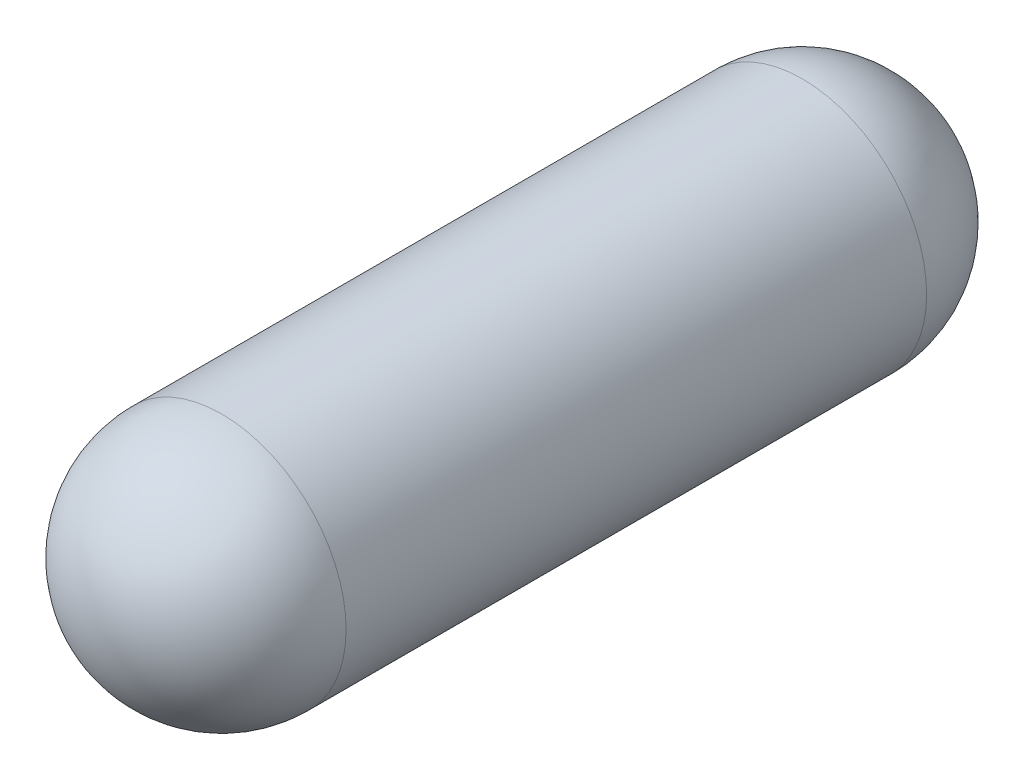
ISO-10303-21;
HEADER;
FILE_DESCRIPTION(('STEP AP214'),'2;1');
FILE_NAME('part.step','',(''),(''),'','','');
FILE_SCHEMA(('AUTOMOTIVE_DESIGN { 1 0 10303 214 1 1 1 1 }'));
ENDSEC;
DATA;
#1=APPLICATION_CONTEXT('core data for automotive mechanical design processes');
#2=APPLICATION_PROTOCOL_DEFINITION('international standard','automotive_design',2000,#1);
#3=PRODUCT_CONTEXT('',#1,'mechanical');
#4=PRODUCT('Part','Part','',(#3));
#5=PRODUCT_RELATED_PRODUCT_CATEGORY('part','',(#4));
#6=PRODUCT_DEFINITION_FORMATION('','',#4);
#7=PRODUCT_DEFINITION_CONTEXT('part definition',#1,'design');
#8=PRODUCT_DEFINITION('design','',#6,#7);
#9=PRODUCT_DEFINITION_SHAPE('','',#8);
#10=(LENGTH_UNIT() NAMED_UNIT(*) SI_UNIT(.MILLI.,.METRE.));
#11=(NAMED_UNIT(*) PLANE_ANGLE_UNIT() SI_UNIT($,.RADIAN.));
#12=(NAMED_UNIT(*) SI_UNIT($,.STERADIAN.) SOLID_ANGLE_UNIT());
#13=UNCERTAINTY_MEASURE_WITH_UNIT(LENGTH_MEASURE(1.E-05),#10,'distance_accuracy_value','');
#14=(GEOMETRIC_REPRESENTATION_CONTEXT(3) GLOBAL_UNCERTAINTY_ASSIGNED_CONTEXT((#13)) GLOBAL_UNIT_ASSIGNED_CONTEXT((#10,
#11,#12)) REPRESENTATION_CONTEXT('',''));
#15=CARTESIAN_POINT('',(0.,0.,0.));
#16=DIRECTION('',(0.,0.,1.));
#17=DIRECTION('',(1.,0.,0.));
#18=AXIS2_PLACEMENT_3D('',#15,#16,#17);
#19=CARTESIAN_POINT('',(0.,0.,20.));
#20=DIRECTION('',(0.,0.,-1.));
#21=DIRECTION('',(-1.,0.,0.));
#22=AXIS2_PLACEMENT_3D('',#19,#20,#21);
#23=CYLINDRICAL_SURFACE('',#22,3.);
#24=CARTESIAN_POINT('',(0.,0.,3.));
#25=DIRECTION('',(0.,0.,-1.));
#26=DIRECTION('',(-1.,0.,0.));
#27=AXIS2_PLACEMENT_3D('',#24,#25,#26);
#28=CIRCLE('',#27,3.);
#29=CARTESIAN_POINT('',(-3.,0.,3.));
#30=VERTEX_POINT('',#29);
#31=EDGE_CURVE('E10',#30,#30,#28,.F.);
#32=ORIENTED_EDGE('',*,*,#31,.T.);
#33=EDGE_LOOP('',(#32));
#34=FACE_BOUND('',#33,.T.);
#35=CARTESIAN_POINT('',(0.,0.,17.));
#36=DIRECTION('',(0.,0.,-1.));
#37=DIRECTION('',(-1.,0.,0.));
#38=AXIS2_PLACEMENT_3D('',#35,#36,#37);
#39=CIRCLE('',#38,3.);
#40=CARTESIAN_POINT('',(-3.,0.,17.));
#41=VERTEX_POINT('',#40);
#42=EDGE_CURVE('E37',#41,#41,#39,.T.);
#43=ORIENTED_EDGE('',*,*,#42,.T.);
#44=EDGE_LOOP('',(#43));
#45=FACE_BOUND('',#44,.T.);
#46=ADVANCED_FACE('F30',(#34,#45),#23,.T.);
#47=CARTESIAN_POINT('',(0.,0.,3.));
#48=DIRECTION('',(0.,0.,1.));
#49=DIRECTION('',(1.,0.,0.));
#50=AXIS2_PLACEMENT_3D('',#47,#48,#49);
#51=SPHERICAL_SURFACE('',#50,3.);
#52=ORIENTED_EDGE('',*,*,#31,.F.);
#53=EDGE_LOOP('',(#52));
#54=FACE_BOUND('',#53,.T.);
#55=ADVANCED_FACE('F45',(#54),#51,.T.);
#56=CARTESIAN_POINT('',(0.,0.,17.));
#57=DIRECTION('',(0.,0.,1.));
#58=DIRECTION('',(1.,0.,0.));
#59=AXIS2_PLACEMENT_3D('',#56,#57,#58);
#60=SPHERICAL_SURFACE('',#59,3.);
#61=ORIENTED_EDGE('',*,*,#42,.F.);
#62=EDGE_LOOP('',(#61));
#63=FACE_BOUND('',#62,.T.);
#64=ADVANCED_FACE('F32',(#63),#60,.T.);
#65=CLOSED_SHELL('',(#46,#55,#64));
#66=MANIFOLD_SOLID_BREP('B2',#65);
#67=ADVANCED_BREP_SHAPE_REPRESENTATION('',(#18,#66),#14);
#68=SHAPE_DEFINITION_REPRESENTATION(#9,#67);
ENDSEC;
END-ISO-10303-21;
